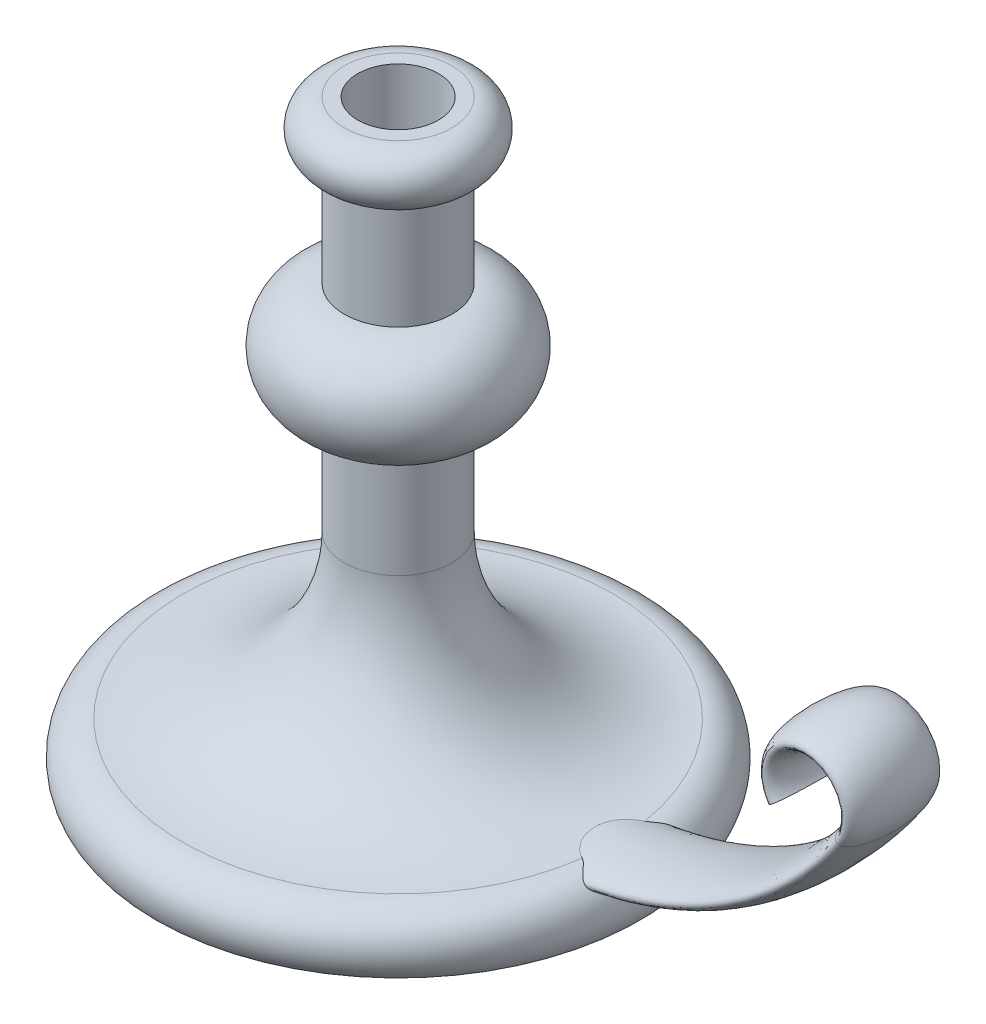
ISO-10303-21;
HEADER;
FILE_DESCRIPTION(('STEP AP214'),'2;1');
FILE_NAME('part.step','',(''),(''),'','','');
FILE_SCHEMA(('AUTOMOTIVE_DESIGN { 1 0 10303 214 1 1 1 1 }'));
ENDSEC;
DATA;
#1=APPLICATION_CONTEXT('core data for automotive mechanical design processes');
#2=APPLICATION_PROTOCOL_DEFINITION('international standard','automotive_design',2000,#1);
#3=PRODUCT_CONTEXT('',#1,'mechanical');
#4=PRODUCT('Part','Part','',(#3));
#5=PRODUCT_RELATED_PRODUCT_CATEGORY('part','',(#4));
#6=PRODUCT_DEFINITION_FORMATION('','',#4);
#7=PRODUCT_DEFINITION_CONTEXT('part definition',#1,'design');
#8=PRODUCT_DEFINITION('design','',#6,#7);
#9=PRODUCT_DEFINITION_SHAPE('','',#8);
#10=(LENGTH_UNIT() NAMED_UNIT(*) SI_UNIT(.MILLI.,.METRE.));
#11=(NAMED_UNIT(*) PLANE_ANGLE_UNIT() SI_UNIT($,.RADIAN.));
#12=(NAMED_UNIT(*) SI_UNIT($,.STERADIAN.) SOLID_ANGLE_UNIT());
#13=UNCERTAINTY_MEASURE_WITH_UNIT(LENGTH_MEASURE(1.E-05),#10,'distance_accuracy_value','');
#14=(GEOMETRIC_REPRESENTATION_CONTEXT(3) GLOBAL_UNCERTAINTY_ASSIGNED_CONTEXT((#13)) GLOBAL_UNIT_ASSIGNED_CONTEXT((#10,
#11,#12)) REPRESENTATION_CONTEXT('',''));
#15=CARTESIAN_POINT('',(0.,0.,0.));
#16=DIRECTION('',(0.,0.,1.));
#17=DIRECTION('',(1.,0.,0.));
#18=AXIS2_PLACEMENT_3D('',#15,#16,#17);
#19=CARTESIAN_POINT('',(0.,0.,0.));
#20=DIRECTION('',(0.,-1.,0.));
#21=DIRECTION('',(0.,0.,-1.));
#22=AXIS2_PLACEMENT_3D('',#19,#20,#21);
#23=PLANE('',#22);
#24=CARTESIAN_POINT('',(0.,0.,0.));
#25=DIRECTION('',(0.,-1.,0.));
#26=DIRECTION('',(0.,0.,-1.));
#27=AXIS2_PLACEMENT_3D('',#24,#25,#26);
#28=CIRCLE('',#27,90.);
#29=CARTESIAN_POINT('',(0.,0.,-90.));
#30=VERTEX_POINT('',#29);
#31=EDGE_CURVE('E67',#30,#30,#28,.T.);
#32=ORIENTED_EDGE('',*,*,#31,.T.);
#33=EDGE_LOOP('',(#32));
#34=FACE_BOUND('',#33,.T.);
#35=ADVANCED_FACE('F41',(#34),#23,.T.);
#36=CARTESIAN_POINT('',(0.,220.,0.));
#37=DIRECTION('',(0.,1.,0.));
#38=DIRECTION('',(0.,0.,1.));
#39=AXIS2_PLACEMENT_3D('',#36,#37,#38);
#40=PLANE('',#39);
#41=CARTESIAN_POINT('',(0.,220.,0.));
#42=DIRECTION('',(0.,1.,0.));
#43=DIRECTION('',(0.,0.,1.));
#44=AXIS2_PLACEMENT_3D('',#41,#42,#43);
#45=CIRCLE('',#44,15.);
#46=CARTESIAN_POINT('',(0.,220.,15.));
#47=VERTEX_POINT('',#46);
#48=EDGE_CURVE('E89',#47,#47,#45,.T.);
#49=ORIENTED_EDGE('',*,*,#48,.F.);
#50=EDGE_LOOP('',(#49));
#51=FACE_BOUND('',#50,.T.);
#52=CARTESIAN_POINT('',(0.,220.,0.));
#53=DIRECTION('',(0.,-1.,0.));
#54=DIRECTION('',(0.,0.,-1.));
#55=AXIS2_PLACEMENT_3D('',#52,#53,#54);
#56=CIRCLE('',#55,20.);
#57=CARTESIAN_POINT('',(0.,220.,-20.));
#58=VERTEX_POINT('',#57);
#59=EDGE_CURVE('E54',#58,#58,#56,.T.);
#60=ORIENTED_EDGE('',*,*,#59,.F.);
#61=EDGE_LOOP('',(#60));
#62=FACE_BOUND('',#61,.T.);
#63=ADVANCED_FACE('F132',(#51,#62),#40,.T.);
#64=CARTESIAN_POINT('',(0.,210.,0.));
#65=DIRECTION('',(0.,-1.,0.));
#66=DIRECTION('',(0.,0.,-1.));
#67=AXIS2_PLACEMENT_3D('',#64,#65,#66);
#68=TOROIDAL_SURFACE('',#67,20.,9.99999999999999);
#69=ORIENTED_EDGE('',*,*,#59,.T.);
#70=EDGE_LOOP('',(#69));
#71=FACE_BOUND('',#70,.T.);
#72=CARTESIAN_POINT('',(0.,200.,0.));
#73=DIRECTION('',(0.,-1.,0.));
#74=DIRECTION('',(0.,0.,-1.));
#75=AXIS2_PLACEMENT_3D('',#72,#73,#74);
#76=CIRCLE('',#75,20.);
#77=CARTESIAN_POINT('',(0.,200.,-20.));
#78=VERTEX_POINT('',#77);
#79=EDGE_CURVE('E173',#78,#78,#76,.T.);
#80=ORIENTED_EDGE('',*,*,#79,.F.);
#81=EDGE_LOOP('',(#80));
#82=FACE_BOUND('',#81,.T.);
#83=ADVANCED_FACE('F138',(#71,#82),#68,.T.);
#84=CARTESIAN_POINT('',(0.,0.,0.));
#85=DIRECTION('',(0.,-1.,0.));
#86=DIRECTION('',(0.,0.,-1.));
#87=AXIS2_PLACEMENT_3D('',#84,#85,#86);
#88=CYLINDRICAL_SURFACE('',#87,20.);
#89=ORIENTED_EDGE('',*,*,#79,.T.);
#90=EDGE_LOOP('',(#89));
#91=FACE_BOUND('',#90,.T.);
#92=CARTESIAN_POINT('',(0.,160.,0.));
#93=DIRECTION('',(0.,-1.,0.));
#94=DIRECTION('',(0.,0.,-1.));
#95=AXIS2_PLACEMENT_3D('',#92,#93,#94);
#96=CIRCLE('',#95,20.);
#97=CARTESIAN_POINT('',(0.,160.,-20.));
#98=VERTEX_POINT('',#97);
#99=EDGE_CURVE('E168',#98,#98,#96,.T.);
#100=ORIENTED_EDGE('',*,*,#99,.F.);
#101=EDGE_LOOP('',(#100));
#102=FACE_BOUND('',#101,.T.);
#103=ADVANCED_FACE('F145',(#91,#102),#88,.T.);
#104=CARTESIAN_POINT('',(0.,140.,0.));
#105=DIRECTION('',(0.,-1.,0.));
#106=DIRECTION('',(0.,0.,-1.));
#107=AXIS2_PLACEMENT_3D('',#104,#105,#106);
#108=TOROIDAL_SURFACE('',#107,20.,20.);
#109=ORIENTED_EDGE('',*,*,#99,.T.);
#110=EDGE_LOOP('',(#109));
#111=FACE_BOUND('',#110,.T.);
#112=CARTESIAN_POINT('',(0.,120.,0.));
#113=DIRECTION('',(0.,-1.,0.));
#114=DIRECTION('',(0.,0.,-1.));
#115=AXIS2_PLACEMENT_3D('',#112,#113,#114);
#116=CIRCLE('',#115,20.);
#117=CARTESIAN_POINT('',(0.,120.,-20.));
#118=VERTEX_POINT('',#117);
#119=EDGE_CURVE('E164',#118,#118,#116,.T.);
#120=ORIENTED_EDGE('',*,*,#119,.F.);
#121=EDGE_LOOP('',(#120));
#122=FACE_BOUND('',#121,.T.);
#123=ADVANCED_FACE('F153',(#111,#122),#108,.T.);
#124=CARTESIAN_POINT('',(0.,0.,0.));
#125=DIRECTION('',(0.,-1.,0.));
#126=DIRECTION('',(0.,0.,-1.));
#127=AXIS2_PLACEMENT_3D('',#124,#125,#126);
#128=CYLINDRICAL_SURFACE('',#127,20.);
#129=ORIENTED_EDGE('',*,*,#119,.T.);
#130=EDGE_LOOP('',(#129));
#131=FACE_BOUND('',#130,.T.);
#132=CARTESIAN_POINT('',(0.,80.,0.));
#133=DIRECTION('',(0.,-1.,0.));
#134=DIRECTION('',(0.,0.,-1.));
#135=AXIS2_PLACEMENT_3D('',#132,#133,#134);
#136=CIRCLE('',#135,20.);
#137=CARTESIAN_POINT('',(0.,80.,-20.));
#138=VERTEX_POINT('',#137);
#139=EDGE_CURVE('E66',#138,#138,#136,.T.);
#140=ORIENTED_EDGE('',*,*,#139,.F.);
#141=EDGE_LOOP('',(#140));
#142=FACE_BOUND('',#141,.T.);
#143=ADVANCED_FACE('F130',(#131,#142),#128,.T.);
#144=CARTESIAN_POINT('',(0.,80.,0.));
#145=DIRECTION('',(0.,-1.,0.));
#146=DIRECTION('',(0.,0.,-1.));
#147=AXIS2_PLACEMENT_3D('',#144,#145,#146);
#148=TOROIDAL_SURFACE('',#147,80.,60.);
#149=CARTESIAN_POINT('',(78.9833852684563,20.,-12.7131762960559));
#150=CARTESIAN_POINT('',(78.8115654435683,19.9999971117905,-12.6232701642003));
#151=CARTESIAN_POINT('',(78.6413520764237,20.0008456056947,-12.5302597230137));
#152=CARTESIAN_POINT('',(78.3043486502372,20.0041628219663,-12.3376910082164));
#153=CARTESIAN_POINT('',(78.1375641418116,20.0066339861982,-12.2381230700893));
#154=CARTESIAN_POINT('',(77.8080319429509,20.0131158273403,-12.0322964637121));
#155=CARTESIAN_POINT('',(77.6452872304086,20.0171276060031,-11.9260330528376));
#156=CARTESIAN_POINT('',(77.324432637578,20.0265838890419,-11.7067207888321));
#157=CARTESIAN_POINT('',(77.1663235465337,20.0320286358334,-11.5936707901123));
#158=CARTESIAN_POINT('',(76.8554619973154,20.0442189940868,-11.3608485256312));
#159=CARTESIAN_POINT('',(76.7027036313986,20.0509631137362,-11.2410840794791));
#160=CARTESIAN_POINT('',(76.4029312325561,20.065610818566,-10.9947452974248));
#161=CARTESIAN_POINT('',(76.2559150078039,20.0735139557519,-10.8681736046406));
#162=CARTESIAN_POINT('',(75.9681199881171,20.0903197667217,-10.6082756096584));
#163=CARTESIAN_POINT('',(75.827339151358,20.0992221098826,-10.4749515496891));
#164=CARTESIAN_POINT('',(75.5524640904349,20.1178533131349,-10.2016649824515));
#165=CARTESIAN_POINT('',(75.4183692012241,20.1275820907603,-10.0617031381522));
#166=CARTESIAN_POINT('',(75.120244260232,20.150534632246,-9.73469768954578));
#167=CARTESIAN_POINT('',(74.9585143719021,20.1639668941541,-9.5455619501382));
#168=CARTESIAN_POINT('',(74.6475553594267,20.1914843229797,-9.15726478187085));
#169=CARTESIAN_POINT('',(74.4983289456568,20.2055696304351,-8.95810119417846));
#170=CARTESIAN_POINT('',(74.213025179648,20.2339779155943,-8.55058420912564));
#171=CARTESIAN_POINT('',(74.0769478251227,20.2483008932568,-8.34223081336322));
#172=CARTESIAN_POINT('',(73.818586680472,20.2767595310121,-7.91764196960884));
#173=CARTESIAN_POINT('',(73.6962789417173,20.2908954773775,-7.7014210999201));
#174=CARTESIAN_POINT('',(73.465393868656,20.318635702702,-7.26174561032505));
#175=CARTESIAN_POINT('',(73.3568162928383,20.3322399910101,-7.03829111774377));
#176=CARTESIAN_POINT('',(73.1534398585357,20.3585844278761,-6.58519277895143));
#177=CARTESIAN_POINT('',(73.0586397503668,20.3713246547527,-6.35554949633676));
#178=CARTESIAN_POINT('',(72.8530561310102,20.3997541726113,-5.812749094059));
#179=CARTESIAN_POINT('',(72.7476473923762,20.4149910121966,-5.49752047415638));
#180=CARTESIAN_POINT('',(72.56078774738,20.4428469982437,-4.86001109256128));
#181=CARTESIAN_POINT('',(72.4793346246538,20.4554663868392,-4.53773098623559));
#182=CARTESIAN_POINT('',(72.3396457574565,20.4776960935388,-3.88765492043916));
#183=CARTESIAN_POINT('',(72.2814401384944,20.487302503808,-3.5598523739181));
#184=CARTESIAN_POINT('',(72.1877941198651,20.5032039998834,-2.90092316380538));
#185=CARTESIAN_POINT('',(72.1523562242515,20.5094987214476,-2.56979613864502));
#186=CARTESIAN_POINT('',(72.100035119899,20.5193093274402,-1.8546577988683));
#187=CARTESIAN_POINT('',(72.0868548961505,20.5222471659906,-1.47036384826507));
#188=CARTESIAN_POINT('',(72.0898086866976,20.5233935522994,-0.701870015914357));
#189=CARTESIAN_POINT('',(72.1059449936461,20.5216017301771,-0.317670143874148));
#190=CARTESIAN_POINT('',(72.1675568357724,20.5133650805124,0.448523271574735));
#191=CARTESIAN_POINT('',(72.2130466465854,20.5069179887677,0.830515650150337));
#192=CARTESIAN_POINT('',(72.3337509557564,20.4896186624652,1.58970070206231));
#193=CARTESIAN_POINT('',(72.408966498239,20.4787662731696,1.96689320632132));
#194=CARTESIAN_POINT('',(72.5970524902982,20.4520570996824,2.74399955544207));
#195=CARTESIAN_POINT('',(72.7124715906827,20.4358671700112,3.14329093844511));
#196=CARTESIAN_POINT('',(72.9796192794278,20.3996916726228,3.92943569993783));
#197=CARTESIAN_POINT('',(73.1313495797102,20.3797059259579,4.31628849102404));
#198=CARTESIAN_POINT('',(73.4712822866767,20.3371524800782,5.07262156501595));
#199=CARTESIAN_POINT('',(73.6594124885173,20.3145899280737,5.44213447034298));
#200=CARTESIAN_POINT('',(74.0719792333903,20.2683409994401,6.16019597276996));
#201=CARTESIAN_POINT('',(74.2964077092791,20.2446548733455,6.50874920451433));
#202=CARTESIAN_POINT('',(74.7499328877887,20.2007974179524,7.13911435291676));
#203=CARTESIAN_POINT('',(74.9749876416236,20.180554932472,7.42383881785002));
#204=CARTESIAN_POINT('',(75.4498328827038,20.1417647777474,7.97197782143991));
#205=CARTESIAN_POINT('',(75.6996231175885,20.1232170912159,8.23539257745644));
#206=CARTESIAN_POINT('',(76.2215734015163,20.0889920159042,8.73966683392337));
#207=CARTESIAN_POINT('',(76.4937530321909,20.0733171792151,8.98050618766964));
#208=CARTESIAN_POINT('',(77.0572096876029,20.0459240029178,9.43874699760172));
#209=CARTESIAN_POINT('',(77.3484821512809,20.0342047224563,9.65615401892595));
#210=CARTESIAN_POINT('',(77.9069197374269,20.0168456652024,10.0402599645747));
#211=CARTESIAN_POINT('',(78.1720926732831,20.0106020763448,10.2098510629948));
#212=CARTESIAN_POINT('',(78.7114481123764,20.0021777289919,10.53169076493));
#213=CARTESIAN_POINT('',(78.9855917462967,19.9999813296679,10.6840039886116));
#214=CARTESIAN_POINT('',(79.2637806982832,20.,10.8283456453195));
#215=B_SPLINE_CURVE_WITH_KNOTS('',3,(#149,#150,#151,#152,#153,#154,#155,#156,#157,#158,#159,
#160,#161,#162,#163,#164,#165,#166,#167,#168,#169,#170,#171,#172,#173,#174,#175,#176,#177,#178,
#179,#180,#181,#182,#183,#184,#185,#186,#187,#188,#189,#190,#191,#192,#193,#194,#195,#196,#197,
#198,#199,#200,#201,#202,#203,#204,#205,#206,#207,#208,#209,#210,#211,#212,#213,#214),
.UNSPECIFIED.,.F.,.F.,(4,2,2,2,2,2,2,2,2,2,2,2,2,2,2,2,2,2,2,2,2,2,2,2,2,2,2,2,2,2,2,2,4),(0.,
0.581751805315699,1.16438106843019,1.74742777044266,2.33057317010736,2.9130530066583,
3.49530828817895,4.07737147451184,4.65937664743604,5.40649731076748,6.15377951054353,
6.90106158037493,7.64702318740525,8.39297167127483,9.1388524516643,10.1360144884354,
11.1330842391253,12.1314418928006,13.1299093296654,14.2823141228681,15.4348090419387,
16.5878648824559,17.7409612279833,18.9871007112175,20.2332989563088,21.4770500594427,
22.7205251228366,23.8095564227791,24.8985766131571,25.9885595925229,27.0782831297272,
28.0221356718067,28.9623328748359),.UNSPECIFIED.);
#216=CARTESIAN_POINT('',(78.9833852684563,20.,-12.713176296056));
#217=VERTEX_POINT('',#216);
#218=CARTESIAN_POINT('',(79.2637806982829,20.,10.8283456453199));
#219=VERTEX_POINT('',#218);
#220=EDGE_CURVE('E69',#217,#219,#215,.T.);
#221=ORIENTED_EDGE('',*,*,#220,.F.);
#222=CARTESIAN_POINT('',(0.,20.,0.));
#223=DIRECTION('',(0.,-1.,0.));
#224=DIRECTION('',(0.,0.,-1.));
#225=AXIS2_PLACEMENT_3D('',#222,#223,#224);
#226=CIRCLE('',#225,80.);
#227=EDGE_CURVE('E60',#219,#217,#226,.T.);
#228=ORIENTED_EDGE('',*,*,#227,.F.);
#229=EDGE_LOOP('',(#221,#228));
#230=FACE_BOUND('',#229,.T.);
#231=ORIENTED_EDGE('',*,*,#139,.T.);
#232=EDGE_LOOP('',(#231));
#233=FACE_BOUND('',#232,.T.);
#234=ADVANCED_FACE('F70',(#230,#233),#148,.F.);
#235=CARTESIAN_POINT('',(0.,7.50000000000001,0.));
#236=DIRECTION('',(0.,-1.,0.));
#237=DIRECTION('',(0.,0.,-1.));
#238=AXIS2_PLACEMENT_3D('',#235,#236,#237);
#239=TOROIDAL_SURFACE('',#238,80.,12.5);
#240=CARTESIAN_POINT('',(79.2637806982829,19.9999999999999,10.8283456453199));
#241=CARTESIAN_POINT('',(79.3372597253333,19.9999994025339,10.8664825312172));
#242=CARTESIAN_POINT('',(79.4096362125859,19.9992707353996,10.9066639018843));
#243=CARTESIAN_POINT('',(79.5522259097359,19.9964422481552,10.990552593409));
#244=CARTESIAN_POINT('',(79.6224405900262,19.9943433825956,11.0342574410668));
#245=CARTESIAN_POINT('',(79.8290099781044,19.9861586068711,11.1692152000433));
#246=CARTESIAN_POINT('',(79.9623962787553,19.9781818138637,11.264903532609));
#247=CARTESIAN_POINT('',(80.2219770986129,19.9577292107812,11.4646103897106));
#248=CARTESIAN_POINT('',(80.34818169997,19.9452598975419,11.5686167170954));
#249=CARTESIAN_POINT('',(80.5936852523153,19.9163409492758,11.7816838975733));
#250=CARTESIAN_POINT('',(80.7130370762451,19.8999290096626,11.8906894110883));
#251=CARTESIAN_POINT('',(80.9473440652599,19.8632763290088,12.1130530006832));
#252=CARTESIAN_POINT('',(81.0622917280099,19.8430293758963,12.2264178974181));
#253=CARTESIAN_POINT('',(81.288622030616,19.7988357892976,12.4560544834294));
#254=CARTESIAN_POINT('',(81.400002668994,19.774887121191,12.5723277416278));
#255=CARTESIAN_POINT('',(81.6840100629599,19.708338401499,12.8747963340982));
#256=CARTESIAN_POINT('',(81.8545753521928,19.6629924574964,13.0623214641639));
#257=CARTESIAN_POINT('',(82.1917756913607,19.5628907541645,13.438211246434));
#258=CARTESIAN_POINT('',(82.3584123917513,19.5081390294388,13.6265755050882));
#259=CARTESIAN_POINT('',(82.690883963065,19.3883254161756,14.001413224749));
#260=CARTESIAN_POINT('',(82.8567166950684,19.3232440383488,14.1878823880349));
#261=CARTESIAN_POINT('',(83.1899523929891,19.1815939654064,14.5549873023056));
#262=CARTESIAN_POINT('',(83.3573549016729,19.1050285234771,14.7356246877521));
#263=CARTESIAN_POINT('',(83.61894458126,18.9766897759401,15.0059878387607));
#264=CARTESIAN_POINT('',(83.7115560462864,18.9296185597787,15.0994661295146));
#265=CARTESIAN_POINT('',(83.8985889468129,18.8311903839691,15.2822502119633));
#266=CARTESIAN_POINT('',(83.9930099973533,18.7798343282231,15.3715568775077));
#267=CARTESIAN_POINT('',(84.1841217280751,18.6724593449103,15.5446544322012));
#268=CARTESIAN_POINT('',(84.2808108239167,18.6164436065762,15.6284490247793));
#269=CARTESIAN_POINT('',(84.4770012861163,18.4992989424408,15.7888784322855));
#270=CARTESIAN_POINT('',(84.5765016571561,18.4381718116482,15.8655157408466));
#271=CARTESIAN_POINT('',(84.7481420451667,18.3297444114105,15.9876611374576));
#272=CARTESIAN_POINT('',(84.819457416273,18.2838523844996,16.0355747629015));
#273=CARTESIAN_POINT('',(84.9637586615748,18.1892954109509,16.1259306593218));
#274=CARTESIAN_POINT('',(85.0367449172774,18.1406298271816,16.1683716657831));
#275=CARTESIAN_POINT('',(85.1842385434571,18.0406079665546,16.2466400686298));
#276=CARTESIAN_POINT('',(85.2587434816725,17.9892558130107,16.2824772391131));
#277=CARTESIAN_POINT('',(85.409173448628,17.8839451524972,16.3464154845289));
#278=CARTESIAN_POINT('',(85.4850973927134,17.8299885900589,16.3745222293397));
#279=CARTESIAN_POINT('',(85.6211243412322,17.7319426123566,16.4165974476185));
#280=CARTESIAN_POINT('',(85.6810144707734,17.6883087180402,16.4323178238723));
#281=CARTESIAN_POINT('',(85.8011703910906,17.5998819870797,16.4578325324165));
#282=CARTESIAN_POINT('',(85.861435980505,17.5550897368339,16.4676298042288));
#283=CARTESIAN_POINT('',(85.9819856330139,17.4646712782752,16.4808854880088));
#284=CARTESIAN_POINT('',(86.0422696580517,17.4190456363474,16.4843480542856));
#285=CARTESIAN_POINT('',(86.1624943665974,17.3273110342976,16.4846867348154));
#286=CARTESIAN_POINT('',(86.2224350470085,17.2812020698266,16.4815627897515));
#287=CARTESIAN_POINT('',(86.3416499617251,17.1888378358816,16.4686541266464));
#288=CARTESIAN_POINT('',(86.4009228474849,17.1425824515603,16.458857771712));
#289=CARTESIAN_POINT('',(86.5182857363334,17.0504235179311,16.4327397886093));
#290=CARTESIAN_POINT('',(86.5763757497013,17.0045199655678,16.416418217171));
#291=CARTESIAN_POINT('',(86.6910664662309,16.9134069150943,16.3775687691008));
#292=CARTESIAN_POINT('',(86.7476660878356,16.8681979304217,16.3550365144287));
#293=CARTESIAN_POINT('',(86.859095423364,16.7787938072367,16.3042313142679));
#294=CARTESIAN_POINT('',(86.9139242054554,16.7345992059304,16.2759554016698));
#295=CARTESIAN_POINT('',(87.0392756920363,16.6331826465226,16.2040872461111));
#296=CARTESIAN_POINT('',(87.1090514006027,16.5764391211173,16.1585126300655));
#297=CARTESIAN_POINT('',(87.2449782011315,16.4654818964498,16.0595319939817));
#298=CARTESIAN_POINT('',(87.3111274076499,16.4112695152802,16.0061219523098));
#299=CARTESIAN_POINT('',(87.4399216042366,16.3054177779844,15.8926367514234));
#300=CARTESIAN_POINT('',(87.5025599723591,16.2537833029486,15.8325495951472));
#301=CARTESIAN_POINT('',(87.6243386515299,16.1531901573188,15.7069028086386));
#302=CARTESIAN_POINT('',(87.6834792894719,16.1042312367032,15.6413436911944));
#303=CARTESIAN_POINT('',(87.8417796982734,15.9729978772486,15.4546191318382));
#304=CARTESIAN_POINT('',(87.9375715653728,15.8933714869108,15.3287275174043));
#305=CARTESIAN_POINT('',(88.1204399161554,15.741205334633,15.0667350616587));
#306=CARTESIAN_POINT('',(88.2075091976122,15.6686714301121,14.9306259433498));
#307=CARTESIAN_POINT('',(88.3742726302237,15.5297283830154,14.6505246707531));
#308=CARTESIAN_POINT('',(88.4539495569198,15.4633335458601,14.5065152913086));
#309=CARTESIAN_POINT('',(88.6067024032676,15.3361044775045,14.2127644593335));
#310=CARTESIAN_POINT('',(88.6797802658571,15.2752686095347,14.0630247125821));
#311=CARTESIAN_POINT('',(88.8152915739016,15.1625548763785,13.7696761744711));
#312=CARTESIAN_POINT('',(88.8781120084387,15.1103480877598,13.6263705801407));
#313=CARTESIAN_POINT('',(88.9993498537026,15.0096949282537,13.3365964429338));
#314=CARTESIAN_POINT('',(89.0577666358109,14.9612490942107,13.1901274523095));
#315=CARTESIAN_POINT('',(89.1707204675097,14.8676798160157,12.8944047260912));
#316=CARTESIAN_POINT('',(89.2252519185729,14.8225611629824,12.7451473481865));
#317=CARTESIAN_POINT('',(89.3307196534345,14.7353998770399,12.4444743219027));
#318=CARTESIAN_POINT('',(89.3816556302437,14.693357506779,12.2930584905537));
#319=CARTESIAN_POINT('',(89.5296086162677,14.5713780611275,11.8359204953631));
#320=CARTESIAN_POINT('',(89.6217081065507,14.4956404569796,11.5274744347266));
#321=CARTESIAN_POINT('',(89.7951145175285,14.3533136513058,10.9038934983792));
#322=CARTESIAN_POINT('',(89.8763680470515,14.2867696545171,10.5887337945023));
#323=CARTESIAN_POINT('',(90.0288849767989,14.1620302318329,9.95472044696577));
#324=CARTESIAN_POINT('',(90.1001578690835,14.1038268723484,9.63587062963314));
#325=CARTESIAN_POINT('',(90.2338151483511,13.9947352681758,8.99515203640513));
#326=CARTESIAN_POINT('',(90.296201110684,13.9438457269825,8.67328380638028));
#327=CARTESIAN_POINT('',(90.417020498081,13.8452362545008,8.0041391754653));
#328=CARTESIAN_POINT('',(90.4748568984835,13.7979994470596,7.65668435820985));
#329=CARTESIAN_POINT('',(90.5819520983969,13.7103396669724,6.95958208476899));
#330=CARTESIAN_POINT('',(90.631210178265,13.6699172660019,6.60993444717262));
#331=CARTESIAN_POINT('',(90.7217274274977,13.5953113675447,5.90861891673206));
#332=CARTESIAN_POINT('',(90.762979258927,13.5611335950876,5.55694947189765));
#333=CARTESIAN_POINT('',(90.8378404668886,13.4986426062201,4.85227255155319));
#334=CARTESIAN_POINT('',(90.8714494363045,13.4703297022238,4.49926500578361));
#335=CARTESIAN_POINT('',(90.9613321075895,13.3936569281174,3.4383870861796));
#336=CARTESIAN_POINT('',(91.0066250966774,13.3535929435582,2.72894897824913));
#337=CARTESIAN_POINT('',(91.0695135584174,13.2939353526451,1.3095033198747));
#338=CARTESIAN_POINT('',(91.0871651110184,13.2743003265279,0.599499854019486));
#339=CARTESIAN_POINT('',(91.0956615173702,13.2546309304938,-0.820498188604214));
#340=CARTESIAN_POINT('',(91.0865229568967,13.2545844358841,-1.53049249885564));
#341=CARTESIAN_POINT('',(91.0414819004258,13.2741053306154,-2.94909845351809));
#342=CARTESIAN_POINT('',(91.0055902347901,13.2936647840564,-3.65771054113417));
#343=CARTESIAN_POINT('',(90.9183944832687,13.3459977025072,-4.89983252058426));
#344=CARTESIAN_POINT('',(90.8729746574634,13.3743915930792,-5.43394785150782));
#345=CARTESIAN_POINT('',(90.7657268352327,13.4436339685118,-6.49976525132051));
#346=CARTESIAN_POINT('',(90.7038982614538,13.4844828916191,-7.03146723462461));
#347=CARTESIAN_POINT('',(90.5628660829359,13.5797093235321,-8.09086208343029));
#348=CARTESIAN_POINT('',(90.4836783653062,13.6340744683385,-8.61855816120933));
#349=CARTESIAN_POINT('',(90.3063526253225,13.7579860255446,-9.66893310613482));
#350=CARTESIAN_POINT('',(90.2082185140206,13.8275293051494,-10.1916129854267));
#351=CARTESIAN_POINT('',(90.0450406138001,13.9450492356204,-10.9701005209443));
#352=CARTESIAN_POINT('',(89.9880025216924,13.9864105983237,-11.2286061521431));
#353=CARTESIAN_POINT('',(89.8681682991259,14.073964622466,-11.7434488595326));
#354=CARTESIAN_POINT('',(89.8053725745312,14.1201569433956,-11.9997860871879));
#355=CARTESIAN_POINT('',(89.6735860437441,14.2178214401046,-12.5095122470671));
#356=CARTESIAN_POINT('',(89.6046028997367,14.2692870966022,-12.7629043986007));
#357=CARTESIAN_POINT('',(89.4597218541693,14.3781771131284,-13.2663962541595));
#358=CARTESIAN_POINT('',(89.3838247045667,14.4356008252615,-13.5164963128499));
#359=CARTESIAN_POINT('',(89.2243765381492,14.5571249223188,-14.0121747656609));
#360=CARTESIAN_POINT('',(89.1408374656154,14.6212149086806,-14.2577595192223));
#361=CARTESIAN_POINT('',(88.9646903294044,14.7573278076633,-14.7441172563862));
#362=CARTESIAN_POINT('',(88.8720628138828,14.829367778463,-14.9848785301702));
#363=CARTESIAN_POINT('',(88.6942962886122,14.9685897805223,-15.4157326914395));
#364=CARTESIAN_POINT('',(88.610892438121,15.0342453749718,-15.607029999751));
#365=CARTESIAN_POINT('',(88.4359765211601,15.1726734846635,-15.9834097485955));
#366=CARTESIAN_POINT('',(88.3444607535359,15.2454492501526,-16.1684892985447));
#367=CARTESIAN_POINT('',(88.1522292463103,15.3990501975608,-16.5296005296577));
#368=CARTESIAN_POINT('',(88.0515426734135,15.479849929417,-16.705658292253));
#369=CARTESIAN_POINT('',(87.8390507654932,15.6510347031618,-17.0458508075555));
#370=CARTESIAN_POINT('',(87.7272582574155,15.7414086949654,-17.2099989447091));
#371=CARTESIAN_POINT('',(87.5058152665119,15.9208514773688,-17.5009675088306));
#372=CARTESIAN_POINT('',(87.3978147232774,16.0085303914944,-17.6298583661787));
#373=CARTESIAN_POINT('',(87.227174168437,16.1470862997561,-17.8096714254832));
#374=CARTESIAN_POINT('',(87.1688241376873,16.1944688016933,-17.8673795293266));
#375=CARTESIAN_POINT('',(87.0490856457392,16.2916456907015,-17.9774308957017));
#376=CARTESIAN_POINT('',(86.987696663375,16.3414404914386,-18.0297732332707));
#377=CARTESIAN_POINT('',(86.8608677872749,16.4441801657366,-18.1288493550867));
#378=CARTESIAN_POINT('',(86.795380205649,16.4971616384532,-18.1754848114696));
#379=CARTESIAN_POINT('',(86.6613305212611,16.6053635721742,-18.2610298064187));
#380=CARTESIAN_POINT('',(86.5927704286355,16.6605825671167,-18.2999443083777));
#381=CARTESIAN_POINT('',(86.4529524305371,16.7728090999766,-18.3688468095747));
#382=CARTESIAN_POINT('',(86.3817010348557,16.8298122713556,-18.398854965849));
#383=CARTESIAN_POINT('',(86.2368478791996,16.9451547948878,-18.4490323169575));
#384=CARTESIAN_POINT('',(86.1632467060619,17.0034938124115,-18.469203948215));
#385=CARTESIAN_POINT('',(86.0238280511079,17.1133260352779,-18.4971307433199));
#386=CARTESIAN_POINT('',(85.9582050617306,17.164750698055,-18.5061347053483));
#387=CARTESIAN_POINT('',(85.8262608165242,17.2674758722196,-18.5159523437075));
#388=CARTESIAN_POINT('',(85.7599396344047,17.3187763960231,-18.5167668761));
#389=CARTESIAN_POINT('',(85.627113018047,17.4207323376518,-18.5103513743195));
#390=CARTESIAN_POINT('',(85.5606074760004,17.471387179064,-18.5031146005546));
#391=CARTESIAN_POINT('',(85.427978174494,17.5715139660057,-18.4810233471447));
#392=CARTESIAN_POINT('',(85.3618544710497,17.6209857411646,-18.466167777167));
#393=CARTESIAN_POINT('',(85.2197826513506,17.7262205502591,-18.4265141309281));
#394=CARTESIAN_POINT('',(85.1439726009581,17.7817092422838,-18.4004977827014));
#395=CARTESIAN_POINT('',(84.9938136292973,17.8901910566274,-18.3402200949265));
#396=CARTESIAN_POINT('',(84.9194658309477,17.9431823015613,-18.3059526674469));
#397=CARTESIAN_POINT('',(84.77238743918,18.0465100660292,-18.2303462426177));
#398=CARTESIAN_POINT('',(84.6996593022252,18.0968426934805,-18.1889972341529));
#399=CARTESIAN_POINT('',(84.5559972417976,18.1947137276632,-18.1004025412124));
#400=CARTESIAN_POINT('',(84.485062999142,18.2422526334955,-18.0531579147332));
#401=CARTESIAN_POINT('',(84.2857832500904,18.3735564970194,-17.9118457290051));
#402=CARTESIAN_POINT('',(84.1594637385324,18.4540664102887,-17.8118883564961));
#403=CARTESIAN_POINT('',(83.9116547179959,18.6066159543111,-17.6001972165384));
#404=CARTESIAN_POINT('',(83.7901701284973,18.6786470968437,-17.4884518565859));
#405=CARTESIAN_POINT('',(83.5504852480865,18.8153700967165,-17.2562396707001));
#406=CARTESIAN_POINT('',(83.4322995704084,18.8800323161311,-17.1357406110709));
#407=CARTESIAN_POINT('',(83.19853135463,19.0025509716316,-16.8888860173472));
#408=CARTESIAN_POINT('',(83.0829495838571,19.0604054222567,-16.7625287896435));
#409=CARTESIAN_POINT('',(82.8296787530843,19.1812978264084,-16.4793965021825));
#410=CARTESIAN_POINT('',(82.6923418970911,19.242947389885,-16.3217187178009));
#411=CARTESIAN_POINT('',(82.4181166032176,19.3583518480504,-16.0030234513428));
#412=CARTESIAN_POINT('',(82.2812283938324,19.4121031930004,-15.8420045045054));
#413=CARTESIAN_POINT('',(82.0061958254453,19.5123981984104,-15.5186416051365));
#414=CARTESIAN_POINT('',(81.868050803328,19.5589377885726,-15.3562969583992));
#415=CARTESIAN_POINT('',(81.5899457583486,19.6448788521029,-15.0335573553847));
#416=CARTESIAN_POINT('',(81.4500083720491,19.6843332920499,-14.8731570796049));
#417=CARTESIAN_POINT('',(81.1655149072293,19.7567248385727,-14.5551374994885));
#418=CARTESIAN_POINT('',(81.0209612577021,19.7896653091291,-14.3975167982178));
#419=CARTESIAN_POINT('',(80.7250971382815,19.8489949894206,-14.0874636141724));
#420=CARTESIAN_POINT('',(80.5737889485126,19.875386390481,-13.9350294107615));
#421=CARTESIAN_POINT('',(80.3461401898895,19.9088684870202,-13.7187593536531));
#422=CARTESIAN_POINT('',(80.2734278715467,19.9186869442986,-13.6515210050565));
#423=CARTESIAN_POINT('',(80.125796755203,19.936790871712,-13.5193350797133));
#424=CARTESIAN_POINT('',(80.0508786728631,19.9450768328487,-13.4543867746683));
#425=CARTESIAN_POINT('',(79.8986038646634,19.9600321388004,-13.3273341516253));
#426=CARTESIAN_POINT('',(79.8212491320174,19.9667027680654,-13.2652276060547));
#427=CARTESIAN_POINT('',(79.6629054747722,19.9783966675949,-13.1437753518676));
#428=CARTESIAN_POINT('',(79.5818858958171,19.9834009742976,-13.0844676089556));
#429=CARTESIAN_POINT('',(79.4166887927781,19.9915356645606,-12.9700897336852));
#430=CARTESIAN_POINT('',(79.332508667968,19.9946644672428,-12.9150232102596));
#431=CARTESIAN_POINT('',(79.1605950545593,19.9988994320776,-12.8099709260221));
#432=CARTESIAN_POINT('',(79.0728502196235,19.9999985174907,-12.7600035133006));
#433=CARTESIAN_POINT('',(78.9833852684563,20.,-12.713176296056));
#434=B_SPLINE_CURVE_WITH_KNOTS('',3,(#240,#241,#242,#243,#244,#245,#246,#247,#248,#249,#250,
#251,#252,#253,#254,#255,#256,#257,#258,#259,#260,#261,#262,#263,#264,#265,#266,#267,#268,#269,
#270,#271,#272,#273,#274,#275,#276,#277,#278,#279,#280,#281,#282,#283,#284,#285,#286,#287,#288,
#289,#290,#291,#292,#293,#294,#295,#296,#297,#298,#299,#300,#301,#302,#303,#304,#305,#306,#307,
#308,#309,#310,#311,#312,#313,#314,#315,#316,#317,#318,#319,#320,#321,#322,#323,#324,#325,#326,
#327,#328,#329,#330,#331,#332,#333,#334,#335,#336,#337,#338,#339,#340,#341,#342,#343,#344,#345,
#346,#347,#348,#349,#350,#351,#352,#353,#354,#355,#356,#357,#358,#359,#360,#361,#362,#363,#364,
#365,#366,#367,#368,#369,#370,#371,#372,#373,#374,#375,#376,#377,#378,#379,#380,#381,#382,#383,
#384,#385,#386,#387,#388,#389,#390,#391,#392,#393,#394,#395,#396,#397,#398,#399,#400,#401,#402,
#403,#404,#405,#406,#407,#408,#409,#410,#411,#412,#413,#414,#415,#416,#417,#418,#419,#420,#421,
#422,#423,#424,#425,#426,#427,#428,#429,#430,#431,#432,#433),.UNSPECIFIED.,.F.,.F.,(4,2,2,2,2,2,
2,2,2,2,2,2,2,2,2,2,2,2,2,2,2,2,2,2,2,2,2,2,2,2,2,2,2,2,2,2,2,2,2,2,2,2,2,2,2,2,2,2,2,2,2,2,2,2,
2,2,2,2,2,2,2,2,2,2,2,2,2,2,2,2,2,2,2,2,2,2,2,2,2,2,2,2,2,2,2,2,2,2,2,2,2,2,2,2,2,2,4),(0.,
0.248266510849736,0.496360250810805,0.98879984324196,1.48053013639167,1.96773405203499,
2.45573401106155,2.94400315577855,3.71629790090205,4.4882621941098,5.26170068051479,
6.03492048093844,6.45407017614673,6.87313167272938,7.29190867388905,7.71053922248984,
8.00258189039808,8.29469191785195,8.58636606904846,8.87782571795295,9.10485469442623,
9.33177090813863,9.55853825645266,9.7853076469987,10.0124735466306,10.2396374713311,
10.4669619399742,10.6944041419209,10.9964013960515,11.2985542000279,11.6012589517519,
11.9039353682019,12.4343359011249,12.9651708365097,13.4972131071107,14.0290982162447,
14.5238002120659,15.0185726930531,15.5140442669976,16.0095580942923,17.0011409442004,
17.9974379319423,18.9927808634959,19.987947134507,21.0539182271257,22.1199787019568,
23.1870116820946,24.2541014871318,26.3891541873418,28.5198695770273,30.6492661181202,
32.7778010912563,34.3878282696682,35.9979121055415,37.6065284973717,39.2148131812851,
40.0185271862116,40.8221845796128,41.6248601539048,42.427448534331,43.2288032356638,
44.0319121133812,44.6879440878073,45.3442769403579,45.9985907994986,46.6521575470816,
47.2198169129069,47.5039176818262,47.7880673426037,48.0765749015779,48.3648963890796,
48.6525602760912,48.9401528749776,49.191329347342,49.4424795633189,49.6938401705404,
49.9452367602401,50.2372350667434,50.5294494834684,50.8220804612982,51.1146590004272,
51.6539487081402,52.1937737957504,52.7356986747419,53.2777812144591,53.9315641440961,
54.5856400140229,55.2400837087452,55.8894104181079,56.5384009177556,57.1871739708362,
57.4856880964191,57.7841064137272,58.0822866552634,58.3837527735715,58.6854726441742,
58.9882425086955),.UNSPECIFIED.);
#435=EDGE_CURVE('E11',#219,#217,#434,.T.);
#436=ORIENTED_EDGE('',*,*,#435,.F.);
#437=ORIENTED_EDGE('',*,*,#227,.T.);
#438=EDGE_LOOP('',(#436,#437));
#439=FACE_BOUND('',#438,.T.);
#440=ORIENTED_EDGE('',*,*,#31,.F.);
#441=EDGE_LOOP('',(#440));
#442=FACE_BOUND('',#441,.T.);
#443=ADVANCED_FACE('F62',(#439,#442),#239,.T.);
#444=CARTESIAN_POINT('',(154.753921056363,77.8333333333334,-1.01547604632283));
#445=DIRECTION('',(0.566666666666667,-0.823947139620552,0.));
#446=DIRECTION('',(0.,0.,-1.));
#447=AXIS2_PLACEMENT_3D('',#444,#445,#446);
#448=PLANE('',#447);
#449=CARTESIAN_POINT('',(154.753921056363,77.8333333333334,-1.01547604632283));
#450=DIRECTION('',(0.566666666666667,-0.823947139620552,0.));
#451=DIRECTION('',(0.,0.,-1.));
#452=AXIS2_PLACEMENT_3D('',#449,#450,#451);
#453=ELLIPSE('',#452,17.5,5.);
#454=CARTESIAN_POINT('',(154.753921056363,77.8333333333334,-18.5154760463228));
#455=VERTEX_POINT('',#454);
#456=EDGE_CURVE('E73',#455,#455,#453,.T.);
#457=ORIENTED_EDGE('',*,*,#456,.T.);
#458=EDGE_LOOP('',(#457));
#459=FACE_BOUND('',#458,.T.);
#460=ADVANCED_FACE('F79',(#459),#448,.T.);
#461=CARTESIAN_POINT('',(60.,15.,-18.5154760463228));
#462=CARTESIAN_POINT('',(108.729851593841,15.,-18.5154760463228));
#463=CARTESIAN_POINT('',(151.858752675137,37.6825114984543,-18.5154760463228));
#464=CARTESIAN_POINT('',(179.47233524498,77.8333333333333,-18.5154760463228));
#465=CARTESIAN_POINT('',(60.,25.,-18.5154760463228));
#466=CARTESIAN_POINT('',(105.369172173576,25.,-18.5154760463228));
#467=CARTESIAN_POINT('',(145.523666283748,46.1182003606298,-18.5154760463228));
#468=CARTESIAN_POINT('',(171.232863848774,83.4999999999999,-18.5154760463228));
#469=CARTESIAN_POINT('',(60.,25.,16.4845239536772));
#470=CARTESIAN_POINT('',(105.369172173576,25.,16.4845239536772));
#471=CARTESIAN_POINT('',(145.523666283748,46.1182003606298,16.4845239536772));
#472=CARTESIAN_POINT('',(171.232863848774,83.4999999999999,16.4845239536772));
#473=CARTESIAN_POINT('',(60.,15.,16.4845239536772));
#474=CARTESIAN_POINT('',(108.729851593841,15.,16.4845239536772));
#475=CARTESIAN_POINT('',(151.858752675137,37.6825114984543,16.4845239536772));
#476=CARTESIAN_POINT('',(179.47233524498,77.8333333333333,16.4845239536772));
#477=CARTESIAN_POINT('',(60.,5.00000000000001,16.4845239536772));
#478=CARTESIAN_POINT('',(112.090531014106,5.00000000000001,16.4845239536772));
#479=CARTESIAN_POINT('',(158.193839066526,29.2468226362787,16.4845239536772));
#480=CARTESIAN_POINT('',(187.711806641185,72.1666666666666,16.4845239536772));
#481=CARTESIAN_POINT('',(60.,5.00000000000001,-18.5154760463228));
#482=CARTESIAN_POINT('',(112.090531014106,5.00000000000001,-18.5154760463228));
#483=CARTESIAN_POINT('',(158.193839066526,29.2468226362787,-18.5154760463228));
#484=CARTESIAN_POINT('',(187.711806641185,72.1666666666666,-18.5154760463228));
#485=CARTESIAN_POINT('',(60.,15.,-18.5154760463228));
#486=CARTESIAN_POINT('',(108.729851593841,15.,-18.5154760463228));
#487=CARTESIAN_POINT('',(151.858752675137,37.6825114984543,-18.5154760463228));
#488=CARTESIAN_POINT('',(179.47233524498,77.8333333333333,-18.5154760463228));
#489=(BOUNDED_SURFACE() B_SPLINE_SURFACE(3,3,((#461,#462,#463,#464),(#465,#466,#467,#468),(#469,
#470,#471,#472),(#473,#474,#475,#476),(#477,#478,#479,#480),(#481,#482,#483,#484),(#485,#486,
#487,#488)),.UNSPECIFIED.,.T.,.F.,.F.) B_SPLINE_SURFACE_WITH_KNOTS((4,3,4),(4,4),(0.,0.5,1.),
(0.,1.),.UNSPECIFIED.) GEOMETRIC_REPRESENTATION_ITEM() RATIONAL_B_SPLINE_SURFACE(((1.,
0.923374135437856,0.923374135437856,1.),(0.333333333333333,0.307791378479285,0.307791378479285,
0.333333333333333),(0.333333333333333,0.307791378479285,0.307791378479285,0.333333333333333),
(1.,0.923374135437856,0.923374135437856,1.),(0.333333333333333,0.307791378479285,
0.307791378479285,0.333333333333333),(0.333333333333333,0.307791378479285,0.307791378479285,
0.333333333333333),(1.,0.923374135437856,0.923374135437856,1.))) REPRESENTATION_ITEM('') SURFACE());
#490=CARTESIAN_POINT('',(179.47233524498,77.8333333333333,-1.01547604632283));
#491=DIRECTION('',(0.566666666666667,0.823947139620552,0.));
#492=DIRECTION('',(0.,0.,-1.));
#493=AXIS2_PLACEMENT_3D('',#490,#491,#492);
#494=ELLIPSE('',#493,17.5,5.);
#495=CARTESIAN_POINT('',(179.47233524498,77.8333333333333,-18.5154760463228));
#496=VERTEX_POINT('',#495);
#497=EDGE_CURVE('E82',#496,#496,#494,.T.);
#498=ORIENTED_EDGE('',*,*,#435,.T.);
#499=ORIENTED_EDGE('',*,*,#220,.T.);
#500=EDGE_LOOP('',(#498,#499));
#501=FACE_BOUND('',#500,.T.);
#502=ORIENTED_EDGE('',*,*,#497,.F.);
#503=EDGE_LOOP('',(#502));
#504=FACE_BOUND('',#503,.T.);
#505=ADVANCED_FACE('F75',(#501,#504),#489,.T.);
#506=CARTESIAN_POINT('',(179.47233524498,77.8333333333333,-18.5154760463228));
#507=CARTESIAN_POINT('',(187.26437834585,89.1631538476184,-18.5154760463228));
#508=CARTESIAN_POINT('',(180.863792446324,101.333333333333,-18.5154760463228));
#509=CARTESIAN_POINT('',(167.113128150672,101.333333333333,-18.5154760463228));
#510=CARTESIAN_POINT('',(153.36246385502,101.333333333333,-18.5154760463228));
#511=CARTESIAN_POINT('',(146.961877955494,89.1631538476184,-18.5154760463228));
#512=CARTESIAN_POINT('',(154.753921056363,77.8333333333334,-18.5154760463228));
#513=CARTESIAN_POINT('',(171.232863848775,83.5,-18.5154760463228));
#514=CARTESIAN_POINT('',(173.830211549064,87.276606838095,-18.5154760463228));
#515=CARTESIAN_POINT('',(171.696682915889,91.3333333333333,-18.5154760463228));
#516=CARTESIAN_POINT('',(167.113128150672,91.3333333333333,-18.5154760463228));
#517=CARTESIAN_POINT('',(162.529573385454,91.3333333333333,-18.5154760463228));
#518=CARTESIAN_POINT('',(160.396044752279,87.276606838095,-18.5154760463228));
#519=CARTESIAN_POINT('',(162.993392452569,83.5,-18.5154760463228));
#520=CARTESIAN_POINT('',(171.232863848775,83.5,16.4845239536772));
#521=CARTESIAN_POINT('',(173.830211549064,87.276606838095,16.4845239536772));
#522=CARTESIAN_POINT('',(171.696682915889,91.3333333333333,16.4845239536772));
#523=CARTESIAN_POINT('',(167.113128150672,91.3333333333333,16.4845239536772));
#524=CARTESIAN_POINT('',(162.529573385454,91.3333333333333,16.4845239536772));
#525=CARTESIAN_POINT('',(160.396044752279,87.276606838095,16.4845239536772));
#526=CARTESIAN_POINT('',(162.993392452569,83.5,16.4845239536772));
#527=CARTESIAN_POINT('',(179.47233524498,77.8333333333333,16.4845239536772));
#528=CARTESIAN_POINT('',(187.26437834585,89.1631538476184,16.4845239536772));
#529=CARTESIAN_POINT('',(180.863792446324,101.333333333333,16.4845239536772));
#530=CARTESIAN_POINT('',(167.113128150672,101.333333333333,16.4845239536772));
#531=CARTESIAN_POINT('',(153.36246385502,101.333333333333,16.4845239536772));
#532=CARTESIAN_POINT('',(146.961877955494,89.1631538476184,16.4845239536772));
#533=CARTESIAN_POINT('',(154.753921056363,77.8333333333334,16.4845239536772));
#534=CARTESIAN_POINT('',(187.711806641185,72.1666666666666,16.4845239536772));
#535=CARTESIAN_POINT('',(200.698545142635,91.0497008571417,16.4845239536772));
#536=CARTESIAN_POINT('',(190.030901976759,111.333333333333,16.4845239536772));
#537=CARTESIAN_POINT('',(167.113128150672,111.333333333333,16.4845239536772));
#538=CARTESIAN_POINT('',(144.195354324585,111.333333333333,16.4845239536772));
#539=CARTESIAN_POINT('',(133.527711158709,91.0497008571418,16.4845239536772));
#540=CARTESIAN_POINT('',(146.514449660158,72.1666666666667,16.4845239536772));
#541=CARTESIAN_POINT('',(187.711806641185,72.1666666666666,-18.5154760463228));
#542=CARTESIAN_POINT('',(200.698545142635,91.0497008571417,-18.5154760463228));
#543=CARTESIAN_POINT('',(190.030901976759,111.333333333333,-18.5154760463228));
#544=CARTESIAN_POINT('',(167.113128150672,111.333333333333,-18.5154760463228));
#545=CARTESIAN_POINT('',(144.195354324585,111.333333333333,-18.5154760463228));
#546=CARTESIAN_POINT('',(133.527711158709,91.0497008571418,-18.5154760463228));
#547=CARTESIAN_POINT('',(146.514449660158,72.1666666666667,-18.5154760463228));
#548=CARTESIAN_POINT('',(179.47233524498,77.8333333333333,-18.5154760463228));
#549=CARTESIAN_POINT('',(187.26437834585,89.1631538476184,-18.5154760463228));
#550=CARTESIAN_POINT('',(180.863792446324,101.333333333333,-18.5154760463228));
#551=CARTESIAN_POINT('',(167.113128150672,101.333333333333,-18.5154760463228));
#552=CARTESIAN_POINT('',(153.36246385502,101.333333333333,-18.5154760463228));
#553=CARTESIAN_POINT('',(146.961877955494,89.1631538476184,-18.5154760463228));
#554=CARTESIAN_POINT('',(154.753921056363,77.8333333333334,-18.5154760463228));
#555=(BOUNDED_SURFACE() B_SPLINE_SURFACE(3,3,((#506,#507,#508,#509,#510,#511,#512),(#513,#514,
#515,#516,#517,#518,#519),(#520,#521,#522,#523,#524,#525,#526),(#527,#528,#529,#530,#531,#532,
#533),(#534,#535,#536,#537,#538,#539,#540),(#541,#542,#543,#544,#545,#546,#547),(#548,#549,#550,
#551,#552,#553,#554)),.UNSPECIFIED.,.T.,.F.,.F.) B_SPLINE_SURFACE_WITH_KNOTS((4,3,4),(4,3,4),
(0.,0.5,1.),(0.,0.5,1.),
.UNSPECIFIED.) GEOMETRIC_REPRESENTATION_ITEM() RATIONAL_B_SPLINE_SURFACE(((1.,0.64364977875042,
0.64364977875042,1.,0.64364977875042,0.64364977875042,1.),(0.333333333333333,0.21454992625014,
0.21454992625014,0.333333333333333,0.21454992625014,0.21454992625014,0.333333333333333),
(0.333333333333333,0.21454992625014,0.21454992625014,0.333333333333333,0.21454992625014,
0.21454992625014,0.333333333333333),(1.,0.64364977875042,0.64364977875042,1.,0.64364977875042,
0.64364977875042,1.),(0.333333333333333,0.21454992625014,0.21454992625014,0.333333333333333,
0.21454992625014,0.21454992625014,0.333333333333333),(0.333333333333333,0.21454992625014,
0.21454992625014,0.333333333333333,0.21454992625014,0.21454992625014,0.333333333333333),(1.,
0.64364977875042,0.64364977875042,1.,0.64364977875042,0.64364977875042,1.))) REPRESENTATION_ITEM('') SURFACE());
#556=ORIENTED_EDGE('',*,*,#456,.F.);
#557=EDGE_LOOP('',(#556));
#558=FACE_BOUND('',#557,.T.);
#559=ORIENTED_EDGE('',*,*,#497,.T.);
#560=EDGE_LOOP('',(#559));
#561=FACE_BOUND('',#560,.T.);
#562=ADVANCED_FACE('F78',(#558,#561),#555,.T.);
#563=CARTESIAN_POINT('',(0.,195.,0.));
#564=DIRECTION('',(0.,1.,0.));
#565=DIRECTION('',(0.,0.,1.));
#566=AXIS2_PLACEMENT_3D('',#563,#564,#565);
#567=CYLINDRICAL_SURFACE('',#566,15.);
#568=CARTESIAN_POINT('',(0.,195.,0.));
#569=DIRECTION('',(0.,1.,0.));
#570=DIRECTION('',(0.,0.,1.));
#571=AXIS2_PLACEMENT_3D('',#568,#569,#570);
#572=CIRCLE('',#571,15.);
#573=CARTESIAN_POINT('',(0.,195.,15.));
#574=VERTEX_POINT('',#573);
#575=EDGE_CURVE('E84',#574,#574,#572,.T.);
#576=ORIENTED_EDGE('',*,*,#575,.F.);
#577=EDGE_LOOP('',(#576));
#578=FACE_BOUND('',#577,.T.);
#579=ORIENTED_EDGE('',*,*,#48,.T.);
#580=EDGE_LOOP('',(#579));
#581=FACE_BOUND('',#580,.T.);
#582=ADVANCED_FACE('F105',(#578,#581),#567,.F.);
#583=CARTESIAN_POINT('',(0.,195.,0.));
#584=DIRECTION('',(0.,1.,0.));
#585=DIRECTION('',(0.,0.,1.));
#586=AXIS2_PLACEMENT_3D('',#583,#584,#585);
#587=PLANE('',#586);
#588=ORIENTED_EDGE('',*,*,#575,.T.);
#589=EDGE_LOOP('',(#588));
#590=FACE_BOUND('',#589,.T.);
#591=ADVANCED_FACE('F220',(#590),#587,.T.);
#592=CLOSED_SHELL('',(#35,#63,#83,#103,#123,#143,#234,#443,#460,#505,#562,#582,#591));
#593=MANIFOLD_SOLID_BREP('B2',#592);
#594=ADVANCED_BREP_SHAPE_REPRESENTATION('',(#18,#593),#14);
#595=SHAPE_DEFINITION_REPRESENTATION(#9,#594);
ENDSEC;
END-ISO-10303-21;
